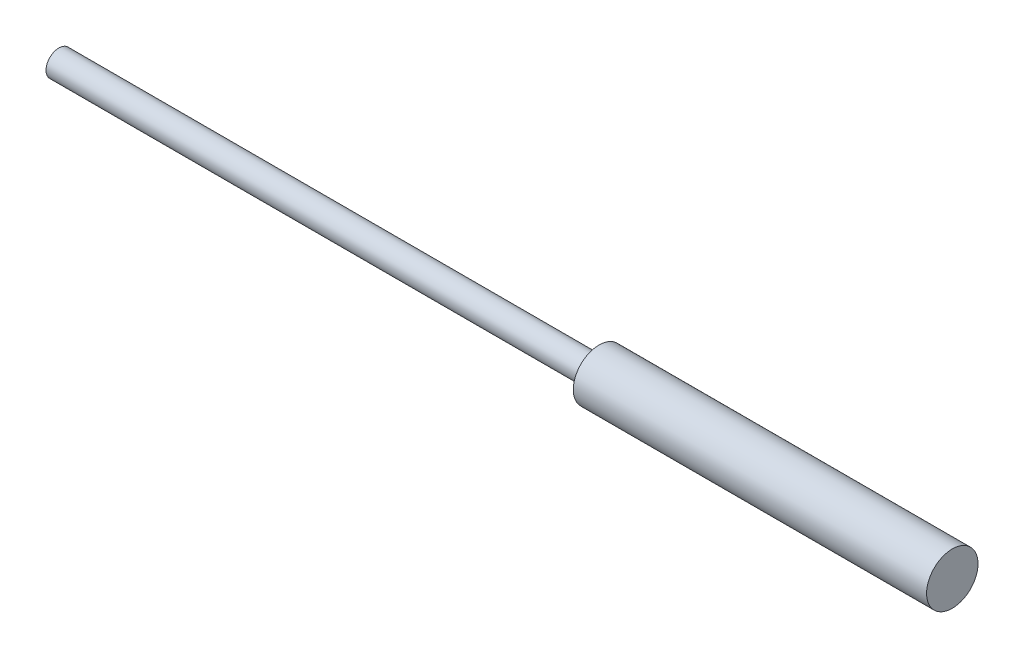
ISO-10303-21;
HEADER;
FILE_DESCRIPTION(('STEP AP214'),'2;1');
FILE_NAME('part.step','',(''),(''),'','','');
FILE_SCHEMA(('AUTOMOTIVE_DESIGN { 1 0 10303 214 1 1 1 1 }'));
ENDSEC;
DATA;
#1=APPLICATION_CONTEXT('core data for automotive mechanical design processes');
#2=APPLICATION_PROTOCOL_DEFINITION('international standard','automotive_design',2000,#1);
#3=PRODUCT_CONTEXT('',#1,'mechanical');
#4=PRODUCT('Part','Part','',(#3));
#5=PRODUCT_RELATED_PRODUCT_CATEGORY('part','',(#4));
#6=PRODUCT_DEFINITION_FORMATION('','',#4);
#7=PRODUCT_DEFINITION_CONTEXT('part definition',#1,'design');
#8=PRODUCT_DEFINITION('design','',#6,#7);
#9=PRODUCT_DEFINITION_SHAPE('','',#8);
#10=(LENGTH_UNIT() NAMED_UNIT(*) SI_UNIT(.MILLI.,.METRE.));
#11=(NAMED_UNIT(*) PLANE_ANGLE_UNIT() SI_UNIT($,.RADIAN.));
#12=(NAMED_UNIT(*) SI_UNIT($,.STERADIAN.) SOLID_ANGLE_UNIT());
#13=UNCERTAINTY_MEASURE_WITH_UNIT(LENGTH_MEASURE(1.E-05),#10,'distance_accuracy_value','');
#14=(GEOMETRIC_REPRESENTATION_CONTEXT(3) GLOBAL_UNCERTAINTY_ASSIGNED_CONTEXT((#13)) GLOBAL_UNIT_ASSIGNED_CONTEXT((#10,
#11,#12)) REPRESENTATION_CONTEXT('',''));
#15=CARTESIAN_POINT('',(0.,0.,0.));
#16=DIRECTION('',(0.,0.,1.));
#17=DIRECTION('',(1.,0.,0.));
#18=AXIS2_PLACEMENT_3D('',#15,#16,#17);
#19=CARTESIAN_POINT('',(2659.79222248442,11.5,18.5));
#20=DIRECTION('',(-1.,0.,0.));
#21=DIRECTION('',(0.,0.,1.));
#22=AXIS2_PLACEMENT_3D('',#19,#20,#21);
#23=CYLINDRICAL_SURFACE('',#22,1.5);
#24=CARTESIAN_POINT('',(2551.34958179731,11.5,18.5));
#25=DIRECTION('',(-1.,0.,0.));
#26=DIRECTION('',(0.,0.,1.));
#27=AXIS2_PLACEMENT_3D('',#24,#25,#26);
#28=CIRCLE('',#27,1.5);
#29=CARTESIAN_POINT('',(2551.34958179731,11.5,20.));
#30=VERTEX_POINT('',#29);
#31=EDGE_CURVE('E10',#30,#30,#28,.T.);
#32=ORIENTED_EDGE('',*,*,#31,.F.);
#33=EDGE_LOOP('',(#32));
#34=FACE_BOUND('',#33,.T.);
#35=CARTESIAN_POINT('',(2614.34958179731,11.5,18.5));
#36=DIRECTION('',(1.,0.,0.));
#37=DIRECTION('',(0.,0.,-1.));
#38=AXIS2_PLACEMENT_3D('',#35,#36,#37);
#39=CIRCLE('',#38,1.5);
#40=CARTESIAN_POINT('',(2614.34958179731,11.5,17.));
#41=VERTEX_POINT('',#40);
#42=EDGE_CURVE('E32',#41,#41,#39,.F.);
#43=ORIENTED_EDGE('',*,*,#42,.T.);
#44=EDGE_LOOP('',(#43));
#45=FACE_BOUND('',#44,.T.);
#46=ADVANCED_FACE('F29',(#34,#45),#23,.T.);
#47=CARTESIAN_POINT('',(2551.34958179731,11.5,18.5));
#48=DIRECTION('',(-1.,0.,0.));
#49=DIRECTION('',(0.,0.,1.));
#50=AXIS2_PLACEMENT_3D('',#47,#48,#49);
#51=PLANE('',#50);
#52=ORIENTED_EDGE('',*,*,#31,.T.);
#53=EDGE_LOOP('',(#52));
#54=FACE_BOUND('',#53,.T.);
#55=ADVANCED_FACE('F60',(#54),#51,.T.);
#56=CARTESIAN_POINT('',(2605.86430042307,11.5,18.5));
#57=DIRECTION('',(1.,0.,0.));
#58=DIRECTION('',(0.,0.,-1.));
#59=AXIS2_PLACEMENT_3D('',#56,#57,#58);
#60=CYLINDRICAL_SURFACE('',#59,3.);
#61=CARTESIAN_POINT('',(2614.34958179731,11.5,18.5));
#62=DIRECTION('',(1.,0.,0.));
#63=DIRECTION('',(0.,0.,-1.));
#64=AXIS2_PLACEMENT_3D('',#61,#62,#63);
#65=CIRCLE('',#64,3.);
#66=CARTESIAN_POINT('',(2614.3495817973,11.5,15.5));
#67=VERTEX_POINT('',#66);
#68=EDGE_CURVE('E39',#67,#67,#65,.T.);
#69=CARTESIAN_POINT('',(2655.54958179731,11.5,18.5));
#70=DIRECTION('',(-1.,0.,0.));
#71=DIRECTION('',(0.,0.,1.));
#72=AXIS2_PLACEMENT_3D('',#69,#70,#71);
#73=CIRCLE('',#72,3.);
#74=CARTESIAN_POINT('',(2655.54958179731,11.5,15.5));
#75=VERTEX_POINT('',#74);
#76=EDGE_CURVE('E43',#75,#75,#73,.T.);
#77=CARTESIAN_POINT('',(2614.3495817973,11.5,15.5));
#78=CARTESIAN_POINT('',(2614.77874846397,11.5,15.5));
#79=CARTESIAN_POINT('',(2615.20791513064,11.5,15.5));
#80=CARTESIAN_POINT('',(2616.06624846397,11.5,15.5));
#81=CARTESIAN_POINT('',(2616.49541513064,11.5,15.5));
#82=CARTESIAN_POINT('',(2617.35374846397,11.5,15.5));
#83=CARTESIAN_POINT('',(2617.78291513064,11.5,15.5));
#84=CARTESIAN_POINT('',(2618.64124846397,11.5,15.5));
#85=CARTESIAN_POINT('',(2619.07041513064,11.5,15.5));
#86=CARTESIAN_POINT('',(2619.92874846397,11.5,15.5));
#87=CARTESIAN_POINT('',(2620.35791513064,11.5,15.5));
#88=CARTESIAN_POINT('',(2621.21624846397,11.5,15.5));
#89=CARTESIAN_POINT('',(2621.64541513064,11.5,15.5));
#90=CARTESIAN_POINT('',(2622.50374846397,11.5,15.5));
#91=CARTESIAN_POINT('',(2622.93291513064,11.5,15.5));
#92=CARTESIAN_POINT('',(2623.79124846397,11.5,15.5));
#93=CARTESIAN_POINT('',(2624.22041513064,11.5,15.5));
#94=CARTESIAN_POINT('',(2625.07874846397,11.5,15.5));
#95=CARTESIAN_POINT('',(2625.50791513064,11.5,15.5));
#96=CARTESIAN_POINT('',(2626.36624846397,11.5,15.5));
#97=CARTESIAN_POINT('',(2626.79541513064,11.5,15.5));
#98=CARTESIAN_POINT('',(2627.65374846397,11.5,15.5));
#99=CARTESIAN_POINT('',(2628.08291513064,11.5,15.5));
#100=CARTESIAN_POINT('',(2628.94124846397,11.5,15.5));
#101=CARTESIAN_POINT('',(2629.37041513064,11.5,15.5));
#102=CARTESIAN_POINT('',(2630.22874846397,11.5,15.5));
#103=CARTESIAN_POINT('',(2630.65791513064,11.5,15.5));
#104=CARTESIAN_POINT('',(2631.51624846397,11.5,15.5));
#105=CARTESIAN_POINT('',(2631.94541513064,11.5,15.5));
#106=CARTESIAN_POINT('',(2632.80374846397,11.5,15.5));
#107=CARTESIAN_POINT('',(2633.23291513064,11.5,15.5));
#108=CARTESIAN_POINT('',(2634.09124846397,11.5,15.5));
#109=CARTESIAN_POINT('',(2634.52041513064,11.5,15.5));
#110=CARTESIAN_POINT('',(2635.37874846397,11.5,15.5));
#111=CARTESIAN_POINT('',(2635.80791513064,11.5,15.5));
#112=CARTESIAN_POINT('',(2636.66624846397,11.5,15.5));
#113=CARTESIAN_POINT('',(2637.09541513064,11.5,15.5));
#114=CARTESIAN_POINT('',(2637.95374846397,11.5,15.5));
#115=CARTESIAN_POINT('',(2638.38291513064,11.5,15.5));
#116=CARTESIAN_POINT('',(2639.24124846397,11.5,15.5));
#117=CARTESIAN_POINT('',(2639.67041513064,11.5,15.5));
#118=CARTESIAN_POINT('',(2640.52874846397,11.5,15.5));
#119=CARTESIAN_POINT('',(2640.95791513064,11.5,15.5));
#120=CARTESIAN_POINT('',(2641.81624846397,11.5,15.5));
#121=CARTESIAN_POINT('',(2642.24541513064,11.5,15.5));
#122=CARTESIAN_POINT('',(2643.10374846397,11.5,15.5));
#123=CARTESIAN_POINT('',(2643.53291513064,11.5,15.5));
#124=CARTESIAN_POINT('',(2644.39124846397,11.5,15.5));
#125=CARTESIAN_POINT('',(2644.82041513064,11.5,15.5));
#126=CARTESIAN_POINT('',(2645.67874846397,11.5,15.5));
#127=CARTESIAN_POINT('',(2646.10791513064,11.5,15.5));
#128=CARTESIAN_POINT('',(2646.96624846397,11.5,15.5));
#129=CARTESIAN_POINT('',(2647.39541513064,11.5,15.5));
#130=CARTESIAN_POINT('',(2648.25374846397,11.5,15.5));
#131=CARTESIAN_POINT('',(2648.68291513064,11.5,15.5));
#132=CARTESIAN_POINT('',(2649.54124846397,11.5,15.5));
#133=CARTESIAN_POINT('',(2649.97041513064,11.5,15.5));
#134=CARTESIAN_POINT('',(2650.82874846397,11.5,15.5));
#135=CARTESIAN_POINT('',(2651.25791513064,11.5,15.5));
#136=CARTESIAN_POINT('',(2652.11624846397,11.5,15.5));
#137=CARTESIAN_POINT('',(2652.54541513064,11.5,15.5));
#138=CARTESIAN_POINT('',(2653.40374846397,11.5,15.5));
#139=CARTESIAN_POINT('',(2653.83291513064,11.5,15.5));
#140=CARTESIAN_POINT('',(2654.69124846397,11.5,15.5));
#141=CARTESIAN_POINT('',(2655.12041513064,11.5,15.5));
#142=CARTESIAN_POINT('',(2655.54958179731,11.5,15.5));
#143=B_SPLINE_CURVE_WITH_KNOTS('',3,(#77,#78,#79,#80,#81,#82,#83,#84,#85,#86,#87,#88,#89,#90,
#91,#92,#93,#94,#95,#96,#97,#98,#99,#100,#101,#102,#103,#104,#105,#106,#107,#108,#109,#110,#111,
#112,#113,#114,#115,#116,#117,#118,#119,#120,#121,#122,#123,#124,#125,#126,#127,#128,#129,#130,
#131,#132,#133,#134,#135,#136,#137,#138,#139,#140,#141,#142),.UNSPECIFIED.,.F.,.F.,(4,2,2,2,2,2,
2,2,2,2,2,2,2,2,2,2,2,2,2,2,2,2,2,2,2,2,2,2,2,2,2,2,4),(0.,1.28750000000011,2.57500000000022,
3.86250000000032,5.15000000000043,6.4375000000001,7.7250000000002,9.01250000000031,
10.3000000000004,11.5875000000005,12.8750000000002,14.1625000000003,15.4500000000004,
16.7375000000005,18.0250000000002,19.3125000000003,20.6000000000004,21.8875000000005,
23.1750000000006,24.4625000000003,25.7500000000004,27.0375000000005,28.3250000000006,
29.6125000000003,30.9000000000004,32.1875000000005,33.4750000000006,34.7625000000007,
36.0500000000004,37.3375000000005,38.6250000000006,39.9125000000007,41.2000000000008),.UNSPECIFIED.);
#144=EDGE_CURVE('BSEAM47',#67,#75,#143,.T.);
#145=ORIENTED_EDGE('',*,*,#68,.T.);
#146=ORIENTED_EDGE('',*,*,#76,.T.);
#147=ORIENTED_EDGE('',*,*,#144,.T.);
#148=ORIENTED_EDGE('',*,*,#144,.F.);
#149=EDGE_LOOP('',(#145,#147,#146,#148));
#150=FACE_BOUND('',#149,.T.);
#151=ADVANCED_FACE('F47',(#150),#60,.T.);
#152=CARTESIAN_POINT('',(2614.34958179731,11.5,11.5));
#153=DIRECTION('',(1.,0.,0.));
#154=DIRECTION('',(0.,0.,-1.));
#155=AXIS2_PLACEMENT_3D('',#152,#153,#154);
#156=PLANE('',#155);
#157=ORIENTED_EDGE('',*,*,#42,.F.);
#158=EDGE_LOOP('',(#157));
#159=FACE_BOUND('',#158,.T.);
#160=ORIENTED_EDGE('',*,*,#68,.F.);
#161=EDGE_LOOP('',(#160));
#162=FACE_BOUND('',#161,.T.);
#163=ADVANCED_FACE('F51',(#159,#162),#156,.F.);
#164=CARTESIAN_POINT('',(2655.54958179731,11.5,11.5));
#165=DIRECTION('',(-1.,0.,0.));
#166=DIRECTION('',(0.,0.,1.));
#167=AXIS2_PLACEMENT_3D('',#164,#165,#166);
#168=PLANE('',#167);
#169=ORIENTED_EDGE('',*,*,#76,.F.);
#170=EDGE_LOOP('',(#169));
#171=FACE_BOUND('',#170,.T.);
#172=ADVANCED_FACE('F49',(#171),#168,.F.);
#173=CLOSED_SHELL('',(#46,#55,#151,#163,#172));
#174=MANIFOLD_SOLID_BREP('B2',#173);
#175=ADVANCED_BREP_SHAPE_REPRESENTATION('',(#18,#174),#14);
#176=SHAPE_DEFINITION_REPRESENTATION(#9,#175);
ENDSEC;
END-ISO-10303-21;
